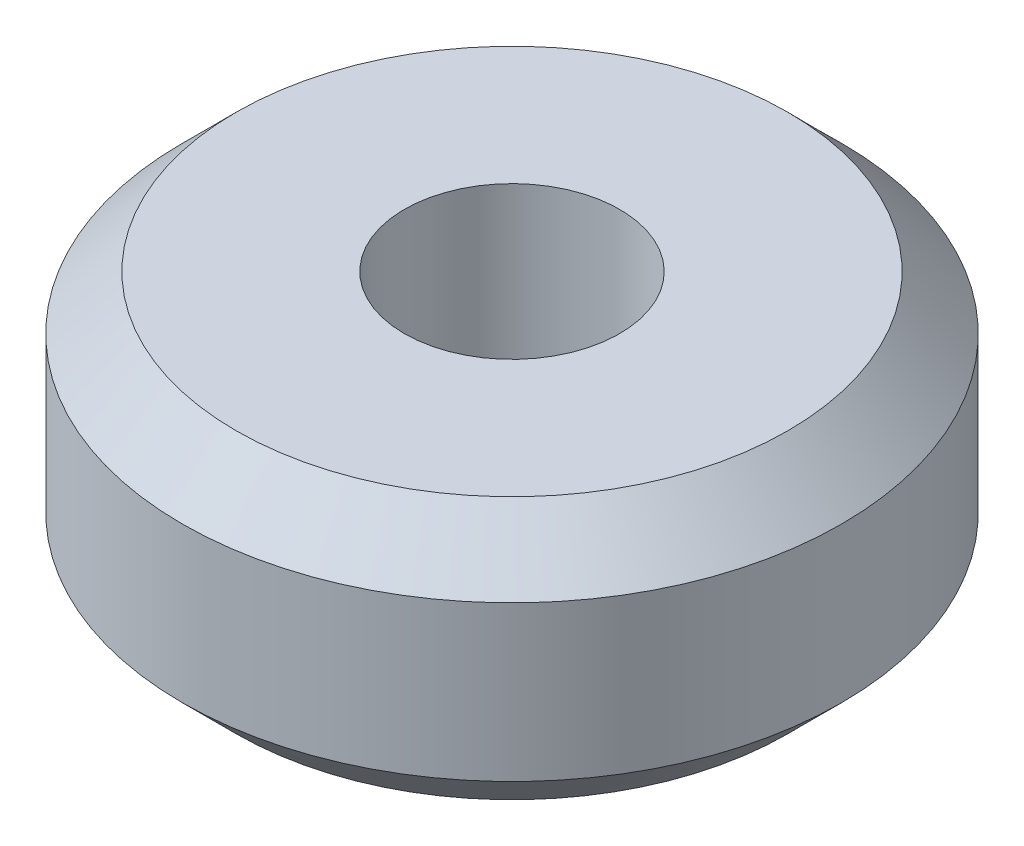
ISO-10303-21;
HEADER;
FILE_DESCRIPTION(('STEP AP214'),'2;1');
FILE_NAME('part.step','',(''),(''),'','','');
FILE_SCHEMA(('AUTOMOTIVE_DESIGN { 1 0 10303 214 1 1 1 1 }'));
ENDSEC;
DATA;
#1=APPLICATION_CONTEXT('core data for automotive mechanical design processes');
#2=APPLICATION_PROTOCOL_DEFINITION('international standard','automotive_design',2000,#1);
#3=PRODUCT_CONTEXT('',#1,'mechanical');
#4=PRODUCT('Part','Part','',(#3));
#5=PRODUCT_RELATED_PRODUCT_CATEGORY('part','',(#4));
#6=PRODUCT_DEFINITION_FORMATION('','',#4);
#7=PRODUCT_DEFINITION_CONTEXT('part definition',#1,'design');
#8=PRODUCT_DEFINITION('design','',#6,#7);
#9=PRODUCT_DEFINITION_SHAPE('','',#8);
#10=(LENGTH_UNIT() NAMED_UNIT(*) SI_UNIT(.MILLI.,.METRE.));
#11=(NAMED_UNIT(*) PLANE_ANGLE_UNIT() SI_UNIT($,.RADIAN.));
#12=(NAMED_UNIT(*) SI_UNIT($,.STERADIAN.) SOLID_ANGLE_UNIT());
#13=UNCERTAINTY_MEASURE_WITH_UNIT(LENGTH_MEASURE(1.E-05),#10,'distance_accuracy_value','');
#14=(GEOMETRIC_REPRESENTATION_CONTEXT(3) GLOBAL_UNCERTAINTY_ASSIGNED_CONTEXT((#13)) GLOBAL_UNIT_ASSIGNED_CONTEXT((#10,
#11,#12)) REPRESENTATION_CONTEXT('',''));
#15=CARTESIAN_POINT('',(0.,0.,0.));
#16=DIRECTION('',(0.,0.,1.));
#17=DIRECTION('',(1.,0.,0.));
#18=AXIS2_PLACEMENT_3D('',#15,#16,#17);
#19=CARTESIAN_POINT('',(0.,3.9,0.));
#20=DIRECTION('',(0.,1.,0.));
#21=DIRECTION('',(0.,0.,1.));
#22=AXIS2_PLACEMENT_3D('',#19,#20,#21);
#23=PLANE('',#22);
#24=CARTESIAN_POINT('',(0.,3.9,0.));
#25=DIRECTION('',(0.,1.,0.));
#26=DIRECTION('',(0.,0.,1.));
#27=AXIS2_PLACEMENT_3D('',#24,#25,#26);
#28=CIRCLE('',#27,4.1);
#29=CARTESIAN_POINT('',(0.,3.9,4.1));
#30=VERTEX_POINT('',#29);
#31=EDGE_CURVE('E10',#30,#30,#28,.T.);
#32=ORIENTED_EDGE('',*,*,#31,.T.);
#33=EDGE_LOOP('',(#32));
#34=FACE_BOUND('',#33,.T.);
#35=CARTESIAN_POINT('',(0.,3.9,0.));
#36=DIRECTION('',(0.,1.,0.));
#37=DIRECTION('',(0.,0.,1.));
#38=AXIS2_PLACEMENT_3D('',#35,#36,#37);
#39=CIRCLE('',#38,1.6);
#40=CARTESIAN_POINT('',(0.,3.9,1.6));
#41=VERTEX_POINT('',#40);
#42=EDGE_CURVE('E54',#41,#41,#39,.T.);
#43=ORIENTED_EDGE('',*,*,#42,.F.);
#44=EDGE_LOOP('',(#43));
#45=FACE_BOUND('',#44,.T.);
#46=ADVANCED_FACE('F33',(#34,#45),#23,.T.);
#47=CARTESIAN_POINT('',(0.,0.,0.));
#48=DIRECTION('',(0.,1.,0.));
#49=DIRECTION('',(0.,0.,1.));
#50=AXIS2_PLACEMENT_3D('',#47,#48,#49);
#51=PLANE('',#50);
#52=CARTESIAN_POINT('',(0.,0.,0.));
#53=DIRECTION('',(0.,1.,0.));
#54=DIRECTION('',(0.,0.,1.));
#55=AXIS2_PLACEMENT_3D('',#52,#53,#54);
#56=CIRCLE('',#55,4.1);
#57=CARTESIAN_POINT('',(0.,0.,4.1));
#58=VERTEX_POINT('',#57);
#59=EDGE_CURVE('E41',#58,#58,#56,.F.);
#60=ORIENTED_EDGE('',*,*,#59,.T.);
#61=EDGE_LOOP('',(#60));
#62=FACE_BOUND('',#61,.T.);
#63=CARTESIAN_POINT('',(0.,0.,0.));
#64=DIRECTION('',(0.,1.,0.));
#65=DIRECTION('',(0.,0.,1.));
#66=AXIS2_PLACEMENT_3D('',#63,#64,#65);
#67=CIRCLE('',#66,1.6);
#68=CARTESIAN_POINT('',(0.,0.,1.6));
#69=VERTEX_POINT('',#68);
#70=EDGE_CURVE('E55',#69,#69,#67,.T.);
#71=ORIENTED_EDGE('',*,*,#70,.T.);
#72=EDGE_LOOP('',(#71));
#73=FACE_BOUND('',#72,.T.);
#74=ADVANCED_FACE('F65',(#62,#73),#51,.F.);
#75=CARTESIAN_POINT('',(0.,3.9,0.));
#76=DIRECTION('',(0.,-1.,0.));
#77=DIRECTION('',(0.,0.,-1.));
#78=AXIS2_PLACEMENT_3D('',#75,#76,#77);
#79=CYLINDRICAL_SURFACE('',#78,4.9);
#80=CARTESIAN_POINT('',(0.,0.800000000000002,0.));
#81=DIRECTION('',(0.,1.,0.));
#82=DIRECTION('',(0.,0.,1.));
#83=AXIS2_PLACEMENT_3D('',#80,#81,#82);
#84=CIRCLE('',#83,4.9);
#85=CARTESIAN_POINT('',(0.,0.800000000000002,4.9));
#86=VERTEX_POINT('',#85);
#87=EDGE_CURVE('E45',#86,#86,#84,.T.);
#88=ORIENTED_EDGE('',*,*,#87,.T.);
#89=EDGE_LOOP('',(#88));
#90=FACE_BOUND('',#89,.T.);
#91=CARTESIAN_POINT('',(0.,3.1,0.));
#92=DIRECTION('',(0.,1.,0.));
#93=DIRECTION('',(0.,0.,1.));
#94=AXIS2_PLACEMENT_3D('',#91,#92,#93);
#95=CIRCLE('',#94,4.9);
#96=CARTESIAN_POINT('',(0.,3.1,4.9));
#97=VERTEX_POINT('',#96);
#98=EDGE_CURVE('E49',#97,#97,#95,.F.);
#99=ORIENTED_EDGE('',*,*,#98,.T.);
#100=EDGE_LOOP('',(#99));
#101=FACE_BOUND('',#100,.T.);
#102=ADVANCED_FACE('F70',(#90,#101),#79,.T.);
#103=CARTESIAN_POINT('',(0.,3.9,0.));
#104=DIRECTION('',(0.,-1.,0.));
#105=DIRECTION('',(0.,0.,-1.));
#106=AXIS2_PLACEMENT_3D('',#103,#104,#105);
#107=CYLINDRICAL_SURFACE('',#106,1.6);
#108=ORIENTED_EDGE('',*,*,#42,.T.);
#109=EDGE_LOOP('',(#108));
#110=FACE_BOUND('',#109,.T.);
#111=ORIENTED_EDGE('',*,*,#70,.F.);
#112=EDGE_LOOP('',(#111));
#113=FACE_BOUND('',#112,.T.);
#114=ADVANCED_FACE('F61',(#110,#113),#107,.F.);
#115=CARTESIAN_POINT('',(0.,0.800000000000002,0.));
#116=DIRECTION('',(0.,1.,0.));
#117=DIRECTION('',(0.,0.,1.));
#118=AXIS2_PLACEMENT_3D('',#115,#116,#117);
#119=CONICAL_SURFACE('',#118,4.9,0.78539816339745);
#120=ORIENTED_EDGE('',*,*,#59,.F.);
#121=EDGE_LOOP('',(#120));
#122=FACE_BOUND('',#121,.T.);
#123=ORIENTED_EDGE('',*,*,#87,.F.);
#124=EDGE_LOOP('',(#123));
#125=FACE_BOUND('',#124,.T.);
#126=ADVANCED_FACE('F77',(#122,#125),#119,.T.);
#127=CARTESIAN_POINT('',(0.,3.9,0.));
#128=DIRECTION('',(0.,-1.,0.));
#129=DIRECTION('',(0.,0.,-1.));
#130=AXIS2_PLACEMENT_3D('',#127,#128,#129);
#131=CONICAL_SURFACE('',#130,4.1,0.785398163397446);
#132=ORIENTED_EDGE('',*,*,#98,.F.);
#133=EDGE_LOOP('',(#132));
#134=FACE_BOUND('',#133,.T.);
#135=ORIENTED_EDGE('',*,*,#31,.F.);
#136=EDGE_LOOP('',(#135));
#137=FACE_BOUND('',#136,.T.);
#138=ADVANCED_FACE('F36',(#134,#137),#131,.T.);
#139=CLOSED_SHELL('',(#46,#74,#102,#114,#126,#138));
#140=MANIFOLD_SOLID_BREP('B2',#139);
#141=ADVANCED_BREP_SHAPE_REPRESENTATION('',(#18,#140),#14);
#142=SHAPE_DEFINITION_REPRESENTATION(#9,#141);
ENDSEC;
END-ISO-10303-21;
